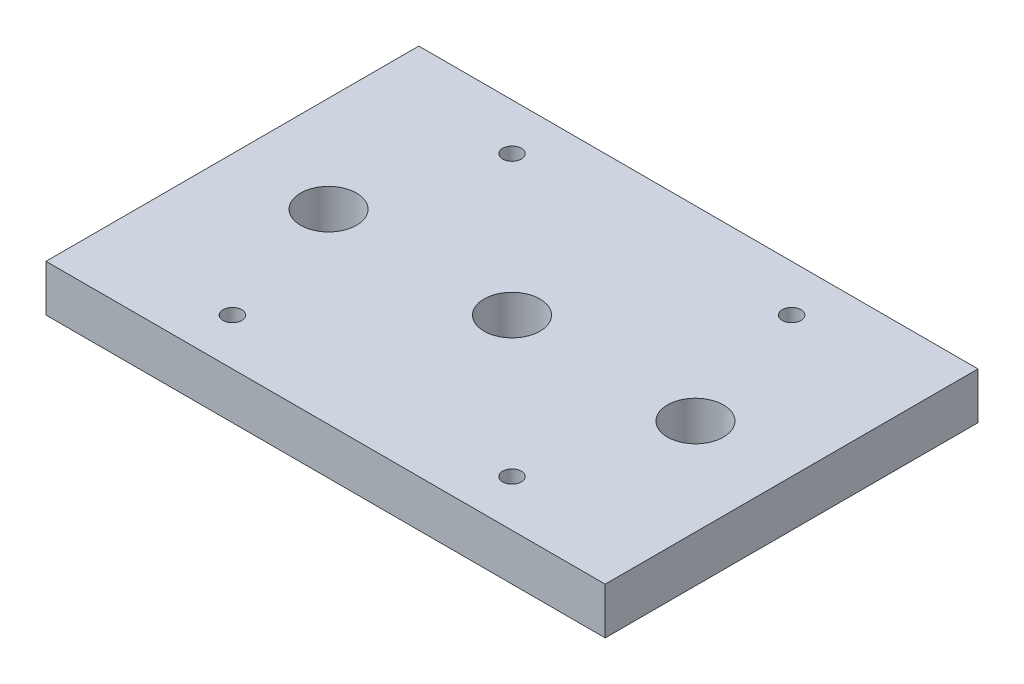
ISO-10303-21;
HEADER;
FILE_DESCRIPTION(('STEP AP214'),'2;1');
FILE_NAME('part.step','',(''),(''),'','','');
FILE_SCHEMA(('AUTOMOTIVE_DESIGN { 1 0 10303 214 1 1 1 1 }'));
ENDSEC;
DATA;
#1=APPLICATION_CONTEXT('core data for automotive mechanical design processes');
#2=APPLICATION_PROTOCOL_DEFINITION('international standard','automotive_design',2000,#1);
#3=PRODUCT_CONTEXT('',#1,'mechanical');
#4=PRODUCT('Part','Part','',(#3));
#5=PRODUCT_RELATED_PRODUCT_CATEGORY('part','',(#4));
#6=PRODUCT_DEFINITION_FORMATION('','',#4);
#7=PRODUCT_DEFINITION_CONTEXT('part definition',#1,'design');
#8=PRODUCT_DEFINITION('design','',#6,#7);
#9=PRODUCT_DEFINITION_SHAPE('','',#8);
#10=(LENGTH_UNIT() NAMED_UNIT(*) SI_UNIT(.MILLI.,.METRE.));
#11=(NAMED_UNIT(*) PLANE_ANGLE_UNIT() SI_UNIT($,.RADIAN.));
#12=(NAMED_UNIT(*) SI_UNIT($,.STERADIAN.) SOLID_ANGLE_UNIT());
#13=UNCERTAINTY_MEASURE_WITH_UNIT(LENGTH_MEASURE(1.E-05),#10,'distance_accuracy_value','');
#14=(GEOMETRIC_REPRESENTATION_CONTEXT(3) GLOBAL_UNCERTAINTY_ASSIGNED_CONTEXT((#13)) GLOBAL_UNIT_ASSIGNED_CONTEXT((#10,
#11,#12)) REPRESENTATION_CONTEXT('',''));
#15=CARTESIAN_POINT('',(0.,0.,0.));
#16=DIRECTION('',(0.,0.,1.));
#17=DIRECTION('',(1.,0.,0.));
#18=AXIS2_PLACEMENT_3D('',#15,#16,#17);
#19=CARTESIAN_POINT('',(0.,12.7,0.));
#20=DIRECTION('',(0.,-1.,0.));
#21=DIRECTION('',(0.,0.,-1.));
#22=AXIS2_PLACEMENT_3D('',#19,#20,#21);
#23=PLANE('',#22);
#24=CARTESIAN_POINT('',(-38.1,12.7,-38.1));
#25=DIRECTION('',(0.,-1.,0.));
#26=DIRECTION('',(0.,0.,-1.));
#27=AXIS2_PLACEMENT_3D('',#24,#25,#26);
#28=CIRCLE('',#27,2.5527);
#29=CARTESIAN_POINT('',(-38.1,12.7,-40.6527));
#30=VERTEX_POINT('',#29);
#31=EDGE_CURVE('E164',#30,#30,#28,.T.);
#32=ORIENTED_EDGE('',*,*,#31,.T.);
#33=EDGE_LOOP('',(#32));
#34=FACE_BOUND('',#33,.T.);
#35=CARTESIAN_POINT('',(38.1,12.7,-38.1));
#36=DIRECTION('',(0.,-1.,0.));
#37=DIRECTION('',(0.,0.,-1.));
#38=AXIS2_PLACEMENT_3D('',#35,#36,#37);
#39=CIRCLE('',#38,2.5527);
#40=CARTESIAN_POINT('',(38.1,12.7,-40.6527));
#41=VERTEX_POINT('',#40);
#42=EDGE_CURVE('E158',#41,#41,#39,.T.);
#43=ORIENTED_EDGE('',*,*,#42,.T.);
#44=EDGE_LOOP('',(#43));
#45=FACE_BOUND('',#44,.T.);
#46=CARTESIAN_POINT('',(38.1000000000008,12.7,38.1));
#47=DIRECTION('',(0.,-1.,0.));
#48=DIRECTION('',(0.,0.,-1.));
#49=AXIS2_PLACEMENT_3D('',#46,#47,#48);
#50=CIRCLE('',#49,2.5527);
#51=CARTESIAN_POINT('',(38.1000000000008,12.7,35.5473));
#52=VERTEX_POINT('',#51);
#53=EDGE_CURVE('E152',#52,#52,#50,.T.);
#54=ORIENTED_EDGE('',*,*,#53,.T.);
#55=EDGE_LOOP('',(#54));
#56=FACE_BOUND('',#55,.T.);
#57=CARTESIAN_POINT('',(-38.0999999999992,12.7,38.1));
#58=DIRECTION('',(0.,-1.,0.));
#59=DIRECTION('',(0.,0.,-1.));
#60=AXIS2_PLACEMENT_3D('',#57,#58,#59);
#61=CIRCLE('',#60,2.5527);
#62=CARTESIAN_POINT('',(-38.0999999999992,12.7,35.5473));
#63=VERTEX_POINT('',#62);
#64=EDGE_CURVE('E146',#63,#63,#61,.T.);
#65=ORIENTED_EDGE('',*,*,#64,.T.);
#66=EDGE_LOOP('',(#65));
#67=FACE_BOUND('',#66,.T.);
#68=CARTESIAN_POINT('',(-50.000000076,12.7,0.));
#69=DIRECTION('',(0.,1.,0.));
#70=DIRECTION('',(0.,0.,1.));
#71=AXIS2_PLACEMENT_3D('',#68,#69,#70);
#72=CIRCLE('',#71,7.62);
#73=CARTESIAN_POINT('',(-50.000000076,12.7,7.62));
#74=VERTEX_POINT('',#73);
#75=EDGE_CURVE('E143',#74,#74,#72,.T.);
#76=ORIENTED_EDGE('',*,*,#75,.F.);
#77=EDGE_LOOP('',(#76));
#78=FACE_BOUND('',#77,.T.);
#79=CARTESIAN_POINT('',(0.,12.7,0.));
#80=DIRECTION('',(0.,1.,0.));
#81=DIRECTION('',(0.,0.,1.));
#82=AXIS2_PLACEMENT_3D('',#79,#80,#81);
#83=CIRCLE('',#82,7.62);
#84=CARTESIAN_POINT('',(0.,12.7,7.62));
#85=VERTEX_POINT('',#84);
#86=EDGE_CURVE('E119',#85,#85,#83,.T.);
#87=ORIENTED_EDGE('',*,*,#86,.F.);
#88=EDGE_LOOP('',(#87));
#89=FACE_BOUND('',#88,.T.);
#90=DIRECTION('',(0.,0.,-1.));
#91=VECTOR('',#90,1.);
#92=CARTESIAN_POINT('',(76.2,12.7,50.8));
#93=LINE('',#92,#91);
#94=CARTESIAN_POINT('',(76.2,12.7,50.8));
#95=VERTEX_POINT('',#94);
#96=CARTESIAN_POINT('',(76.2,12.7,-50.8));
#97=VERTEX_POINT('',#96);
#98=EDGE_CURVE('E85',#95,#97,#93,.T.);
#99=ORIENTED_EDGE('',*,*,#98,.T.);
#100=DIRECTION('',(-1.,0.,0.));
#101=VECTOR('',#100,1.);
#102=CARTESIAN_POINT('',(-76.2,12.7,-50.8));
#103=LINE('',#102,#101);
#104=CARTESIAN_POINT('',(-76.2,12.7,-50.8));
#105=VERTEX_POINT('',#104);
#106=EDGE_CURVE('E80',#97,#105,#103,.T.);
#107=ORIENTED_EDGE('',*,*,#106,.T.);
#108=DIRECTION('',(0.,0.,1.));
#109=VECTOR('',#108,1.);
#110=CARTESIAN_POINT('',(-76.2,12.7,50.8));
#111=LINE('',#110,#109);
#112=CARTESIAN_POINT('',(-76.2,12.7,50.8));
#113=VERTEX_POINT('',#112);
#114=EDGE_CURVE('E83',#105,#113,#111,.T.);
#115=ORIENTED_EDGE('',*,*,#114,.T.);
#116=DIRECTION('',(1.,0.,0.));
#117=VECTOR('',#116,1.);
#118=CARTESIAN_POINT('',(-76.2,12.7,50.8));
#119=LINE('',#118,#117);
#120=EDGE_CURVE('E50',#113,#95,#119,.T.);
#121=ORIENTED_EDGE('',*,*,#120,.T.);
#122=EDGE_LOOP('',(#99,#107,#115,#121));
#123=FACE_BOUND('',#122,.T.);
#124=CARTESIAN_POINT('',(50.000000076,12.7,0.));
#125=DIRECTION('',(0.,1.,0.));
#126=DIRECTION('',(0.,0.,1.));
#127=AXIS2_PLACEMENT_3D('',#124,#125,#126);
#128=CIRCLE('',#127,7.62);
#129=CARTESIAN_POINT('',(50.000000076,12.7,7.62));
#130=VERTEX_POINT('',#129);
#131=EDGE_CURVE('E131',#130,#130,#128,.T.);
#132=ORIENTED_EDGE('',*,*,#131,.F.);
#133=EDGE_LOOP('',(#132));
#134=FACE_BOUND('',#133,.T.);
#135=ADVANCED_FACE('F33',(#34,#45,#56,#67,#78,#89,#123,#134),#23,.F.);
#136=CARTESIAN_POINT('',(76.2,12.7,50.8));
#137=DIRECTION('',(-1.,0.,0.));
#138=DIRECTION('',(0.,0.,1.));
#139=AXIS2_PLACEMENT_3D('',#136,#137,#138);
#140=PLANE('',#139);
#141=DIRECTION('',(0.,0.,-1.));
#142=VECTOR('',#141,1.);
#143=CARTESIAN_POINT('',(76.2,0.,50.8));
#144=LINE('',#143,#142);
#145=CARTESIAN_POINT('',(76.2,0.,50.8));
#146=VERTEX_POINT('',#145);
#147=CARTESIAN_POINT('',(76.2,0.,-50.8));
#148=VERTEX_POINT('',#147);
#149=EDGE_CURVE('E97',#146,#148,#144,.T.);
#150=ORIENTED_EDGE('',*,*,#149,.T.);
#151=DIRECTION('',(0.,-1.,0.));
#152=VECTOR('',#151,1.);
#153=CARTESIAN_POINT('',(76.2,12.7,-50.8));
#154=LINE('',#153,#152);
#155=EDGE_CURVE('E11',#97,#148,#154,.T.);
#156=ORIENTED_EDGE('',*,*,#155,.F.);
#157=ORIENTED_EDGE('',*,*,#98,.F.);
#158=DIRECTION('',(0.,-1.,0.));
#159=VECTOR('',#158,1.);
#160=CARTESIAN_POINT('',(76.2,12.7,50.8));
#161=LINE('',#160,#159);
#162=EDGE_CURVE('E93',#95,#146,#161,.T.);
#163=ORIENTED_EDGE('',*,*,#162,.T.);
#164=EDGE_LOOP('',(#150,#156,#157,#163));
#165=FACE_BOUND('',#164,.T.);
#166=ADVANCED_FACE('F35',(#165),#140,.F.);
#167=CARTESIAN_POINT('',(-76.2,12.7,-50.8));
#168=DIRECTION('',(0.,0.,1.));
#169=DIRECTION('',(1.,0.,0.));
#170=AXIS2_PLACEMENT_3D('',#167,#168,#169);
#171=PLANE('',#170);
#172=DIRECTION('',(-1.,0.,0.));
#173=VECTOR('',#172,1.);
#174=CARTESIAN_POINT('',(-76.2,0.,-50.8));
#175=LINE('',#174,#173);
#176=CARTESIAN_POINT('',(-76.2,0.,-50.8));
#177=VERTEX_POINT('',#176);
#178=EDGE_CURVE('E89',#148,#177,#175,.T.);
#179=ORIENTED_EDGE('',*,*,#178,.T.);
#180=DIRECTION('',(0.,-1.,0.));
#181=VECTOR('',#180,1.);
#182=CARTESIAN_POINT('',(-76.2,12.7,-50.8));
#183=LINE('',#182,#181);
#184=EDGE_CURVE('E42',#105,#177,#183,.T.);
#185=ORIENTED_EDGE('',*,*,#184,.F.);
#186=ORIENTED_EDGE('',*,*,#106,.F.);
#187=ORIENTED_EDGE('',*,*,#155,.T.);
#188=EDGE_LOOP('',(#179,#185,#186,#187));
#189=FACE_BOUND('',#188,.T.);
#190=ADVANCED_FACE('F88',(#189),#171,.F.);
#191=CARTESIAN_POINT('',(-76.2,12.7,50.8));
#192=DIRECTION('',(1.,0.,0.));
#193=DIRECTION('',(0.,0.,-1.));
#194=AXIS2_PLACEMENT_3D('',#191,#192,#193);
#195=PLANE('',#194);
#196=DIRECTION('',(0.,0.,1.));
#197=VECTOR('',#196,1.);
#198=CARTESIAN_POINT('',(-76.2,0.,50.8));
#199=LINE('',#198,#197);
#200=CARTESIAN_POINT('',(-76.2,0.,50.8));
#201=VERTEX_POINT('',#200);
#202=EDGE_CURVE('E67',#177,#201,#199,.T.);
#203=ORIENTED_EDGE('',*,*,#202,.T.);
#204=DIRECTION('',(0.,-1.,0.));
#205=VECTOR('',#204,1.);
#206=CARTESIAN_POINT('',(-76.2,12.7,50.8));
#207=LINE('',#206,#205);
#208=EDGE_CURVE('E90',#113,#201,#207,.T.);
#209=ORIENTED_EDGE('',*,*,#208,.F.);
#210=ORIENTED_EDGE('',*,*,#114,.F.);
#211=ORIENTED_EDGE('',*,*,#184,.T.);
#212=EDGE_LOOP('',(#203,#209,#210,#211));
#213=FACE_BOUND('',#212,.T.);
#214=ADVANCED_FACE('F91',(#213),#195,.F.);
#215=CARTESIAN_POINT('',(-76.2,12.7,50.8));
#216=DIRECTION('',(0.,0.,-1.));
#217=DIRECTION('',(-1.,0.,0.));
#218=AXIS2_PLACEMENT_3D('',#215,#216,#217);
#219=PLANE('',#218);
#220=DIRECTION('',(1.,0.,0.));
#221=VECTOR('',#220,1.);
#222=CARTESIAN_POINT('',(-76.2,0.,50.8));
#223=LINE('',#222,#221);
#224=EDGE_CURVE('E73',#201,#146,#223,.T.);
#225=ORIENTED_EDGE('',*,*,#224,.T.);
#226=ORIENTED_EDGE('',*,*,#162,.F.);
#227=ORIENTED_EDGE('',*,*,#120,.F.);
#228=ORIENTED_EDGE('',*,*,#208,.T.);
#229=EDGE_LOOP('',(#225,#226,#227,#228));
#230=FACE_BOUND('',#229,.T.);
#231=ADVANCED_FACE('F105',(#230),#219,.F.);
#232=CARTESIAN_POINT('',(0.,0.,0.));
#233=DIRECTION('',(0.,-1.,0.));
#234=DIRECTION('',(0.,0.,-1.));
#235=AXIS2_PLACEMENT_3D('',#232,#233,#234);
#236=PLANE('',#235);
#237=CARTESIAN_POINT('',(-38.1,0.,-38.1));
#238=DIRECTION('',(0.,-1.,0.));
#239=DIRECTION('',(0.,0.,-1.));
#240=AXIS2_PLACEMENT_3D('',#237,#238,#239);
#241=CIRCLE('',#240,2.5527);
#242=CARTESIAN_POINT('',(-38.1,0.,-40.6527));
#243=VERTEX_POINT('',#242);
#244=EDGE_CURVE('E167',#243,#243,#241,.T.);
#245=ORIENTED_EDGE('',*,*,#244,.F.);
#246=EDGE_LOOP('',(#245));
#247=FACE_BOUND('',#246,.T.);
#248=CARTESIAN_POINT('',(38.1,0.,-38.1));
#249=DIRECTION('',(0.,-1.,0.));
#250=DIRECTION('',(0.,0.,-1.));
#251=AXIS2_PLACEMENT_3D('',#248,#249,#250);
#252=CIRCLE('',#251,2.5527);
#253=CARTESIAN_POINT('',(38.1,0.,-40.6527));
#254=VERTEX_POINT('',#253);
#255=EDGE_CURVE('E161',#254,#254,#252,.T.);
#256=ORIENTED_EDGE('',*,*,#255,.F.);
#257=EDGE_LOOP('',(#256));
#258=FACE_BOUND('',#257,.T.);
#259=CARTESIAN_POINT('',(38.1000000000008,0.,38.1));
#260=DIRECTION('',(0.,-1.,0.));
#261=DIRECTION('',(0.,0.,-1.));
#262=AXIS2_PLACEMENT_3D('',#259,#260,#261);
#263=CIRCLE('',#262,2.5527);
#264=CARTESIAN_POINT('',(38.1000000000008,0.,35.5473));
#265=VERTEX_POINT('',#264);
#266=EDGE_CURVE('E155',#265,#265,#263,.T.);
#267=ORIENTED_EDGE('',*,*,#266,.F.);
#268=EDGE_LOOP('',(#267));
#269=FACE_BOUND('',#268,.T.);
#270=CARTESIAN_POINT('',(-38.0999999999992,0.,38.1));
#271=DIRECTION('',(0.,-1.,0.));
#272=DIRECTION('',(0.,0.,-1.));
#273=AXIS2_PLACEMENT_3D('',#270,#271,#272);
#274=CIRCLE('',#273,2.5527);
#275=CARTESIAN_POINT('',(-38.0999999999992,0.,35.5473));
#276=VERTEX_POINT('',#275);
#277=EDGE_CURVE('E149',#276,#276,#274,.T.);
#278=ORIENTED_EDGE('',*,*,#277,.F.);
#279=EDGE_LOOP('',(#278));
#280=FACE_BOUND('',#279,.T.);
#281=CARTESIAN_POINT('',(-50.000000076,0.,0.));
#282=DIRECTION('',(0.,1.,0.));
#283=DIRECTION('',(0.,0.,1.));
#284=AXIS2_PLACEMENT_3D('',#281,#282,#283);
#285=CIRCLE('',#284,5.04189999999999);
#286=CARTESIAN_POINT('',(-50.000000076,0.,5.04189999999999));
#287=VERTEX_POINT('',#286);
#288=EDGE_CURVE('E134',#287,#287,#285,.T.);
#289=ORIENTED_EDGE('',*,*,#288,.T.);
#290=EDGE_LOOP('',(#289));
#291=FACE_BOUND('',#290,.T.);
#292=CARTESIAN_POINT('',(50.000000076,0.,0.));
#293=DIRECTION('',(0.,1.,0.));
#294=DIRECTION('',(0.,0.,1.));
#295=AXIS2_PLACEMENT_3D('',#292,#293,#294);
#296=CIRCLE('',#295,5.04189999999999);
#297=CARTESIAN_POINT('',(50.000000076,0.,5.04189999999999));
#298=VERTEX_POINT('',#297);
#299=EDGE_CURVE('E122',#298,#298,#296,.T.);
#300=ORIENTED_EDGE('',*,*,#299,.T.);
#301=EDGE_LOOP('',(#300));
#302=FACE_BOUND('',#301,.T.);
#303=CARTESIAN_POINT('',(0.,0.,0.));
#304=DIRECTION('',(0.,1.,0.));
#305=DIRECTION('',(0.,0.,1.));
#306=AXIS2_PLACEMENT_3D('',#303,#304,#305);
#307=CIRCLE('',#306,5.0419);
#308=CARTESIAN_POINT('',(0.,0.,5.0419));
#309=VERTEX_POINT('',#308);
#310=EDGE_CURVE('E100',#309,#309,#307,.T.);
#311=ORIENTED_EDGE('',*,*,#310,.T.);
#312=EDGE_LOOP('',(#311));
#313=FACE_BOUND('',#312,.T.);
#314=ORIENTED_EDGE('',*,*,#149,.F.);
#315=ORIENTED_EDGE('',*,*,#224,.F.);
#316=ORIENTED_EDGE('',*,*,#202,.F.);
#317=ORIENTED_EDGE('',*,*,#178,.F.);
#318=EDGE_LOOP('',(#314,#315,#316,#317));
#319=FACE_BOUND('',#318,.T.);
#320=ADVANCED_FACE('F108',(#247,#258,#269,#280,#291,#302,#313,#319),#236,.T.);
#321=CARTESIAN_POINT('',(0.,12.7,0.));
#322=DIRECTION('',(0.,1.,0.));
#323=DIRECTION('',(0.,0.,1.));
#324=AXIS2_PLACEMENT_3D('',#321,#322,#323);
#325=CYLINDRICAL_SURFACE('',#324,5.0419);
#326=ORIENTED_EDGE('',*,*,#310,.F.);
#327=EDGE_LOOP('',(#326));
#328=FACE_BOUND('',#327,.T.);
#329=CARTESIAN_POINT('',(0.,1.524,0.));
#330=DIRECTION('',(0.,1.,0.));
#331=DIRECTION('',(0.,0.,1.));
#332=AXIS2_PLACEMENT_3D('',#329,#330,#331);
#333=CIRCLE('',#332,5.0419);
#334=CARTESIAN_POINT('',(0.,1.524,5.0419));
#335=VERTEX_POINT('',#334);
#336=EDGE_CURVE('E113',#335,#335,#333,.T.);
#337=ORIENTED_EDGE('',*,*,#336,.T.);
#338=EDGE_LOOP('',(#337));
#339=FACE_BOUND('',#338,.T.);
#340=ADVANCED_FACE('F175',(#328,#339),#325,.F.);
#341=CARTESIAN_POINT('',(5.0419,1.524,0.));
#342=DIRECTION('',(0.,-1.,0.));
#343=DIRECTION('',(0.,0.,-1.));
#344=AXIS2_PLACEMENT_3D('',#341,#342,#343);
#345=PLANE('',#344);
#346=ORIENTED_EDGE('',*,*,#336,.F.);
#347=EDGE_LOOP('',(#346));
#348=FACE_BOUND('',#347,.T.);
#349=CARTESIAN_POINT('',(0.,1.524,0.));
#350=DIRECTION('',(0.,1.,0.));
#351=DIRECTION('',(0.,0.,1.));
#352=AXIS2_PLACEMENT_3D('',#349,#350,#351);
#353=CIRCLE('',#352,7.62);
#354=CARTESIAN_POINT('',(0.,1.524,7.62));
#355=VERTEX_POINT('',#354);
#356=EDGE_CURVE('E116',#355,#355,#353,.T.);
#357=ORIENTED_EDGE('',*,*,#356,.T.);
#358=EDGE_LOOP('',(#357));
#359=FACE_BOUND('',#358,.T.);
#360=ADVANCED_FACE('F191',(#348,#359),#345,.F.);
#361=CARTESIAN_POINT('',(0.,12.7,0.));
#362=DIRECTION('',(0.,1.,0.));
#363=DIRECTION('',(0.,0.,1.));
#364=AXIS2_PLACEMENT_3D('',#361,#362,#363);
#365=CYLINDRICAL_SURFACE('',#364,7.62);
#366=ORIENTED_EDGE('',*,*,#356,.F.);
#367=EDGE_LOOP('',(#366));
#368=FACE_BOUND('',#367,.T.);
#369=ORIENTED_EDGE('',*,*,#86,.T.);
#370=EDGE_LOOP('',(#369));
#371=FACE_BOUND('',#370,.T.);
#372=ADVANCED_FACE('F197',(#368,#371),#365,.F.);
#373=CARTESIAN_POINT('',(50.000000076,12.7,0.));
#374=DIRECTION('',(0.,1.,0.));
#375=DIRECTION('',(0.,0.,1.));
#376=AXIS2_PLACEMENT_3D('',#373,#374,#375);
#377=CYLINDRICAL_SURFACE('',#376,5.0419);
#378=ORIENTED_EDGE('',*,*,#299,.F.);
#379=EDGE_LOOP('',(#378));
#380=FACE_BOUND('',#379,.T.);
#381=CARTESIAN_POINT('',(50.000000076,1.524,0.));
#382=DIRECTION('',(0.,1.,0.));
#383=DIRECTION('',(0.,0.,1.));
#384=AXIS2_PLACEMENT_3D('',#381,#382,#383);
#385=CIRCLE('',#384,5.0419);
#386=CARTESIAN_POINT('',(50.000000076,1.524,5.0419));
#387=VERTEX_POINT('',#386);
#388=EDGE_CURVE('E125',#387,#387,#385,.T.);
#389=ORIENTED_EDGE('',*,*,#388,.T.);
#390=EDGE_LOOP('',(#389));
#391=FACE_BOUND('',#390,.T.);
#392=ADVANCED_FACE('F203',(#380,#391),#377,.F.);
#393=CARTESIAN_POINT('',(55.041900076,1.524,0.));
#394=DIRECTION('',(0.,-1.,0.));
#395=DIRECTION('',(0.,0.,-1.));
#396=AXIS2_PLACEMENT_3D('',#393,#394,#395);
#397=PLANE('',#396);
#398=ORIENTED_EDGE('',*,*,#388,.F.);
#399=EDGE_LOOP('',(#398));
#400=FACE_BOUND('',#399,.T.);
#401=CARTESIAN_POINT('',(50.000000076,1.524,0.));
#402=DIRECTION('',(0.,1.,0.));
#403=DIRECTION('',(0.,0.,1.));
#404=AXIS2_PLACEMENT_3D('',#401,#402,#403);
#405=CIRCLE('',#404,7.61999999999999);
#406=CARTESIAN_POINT('',(50.000000076,1.524,7.61999999999999));
#407=VERTEX_POINT('',#406);
#408=EDGE_CURVE('E128',#407,#407,#405,.T.);
#409=ORIENTED_EDGE('',*,*,#408,.T.);
#410=EDGE_LOOP('',(#409));
#411=FACE_BOUND('',#410,.T.);
#412=ADVANCED_FACE('F254',(#400,#411),#397,.F.);
#413=CARTESIAN_POINT('',(50.000000076,12.7,0.));
#414=DIRECTION('',(0.,1.,0.));
#415=DIRECTION('',(0.,0.,1.));
#416=AXIS2_PLACEMENT_3D('',#413,#414,#415);
#417=CYLINDRICAL_SURFACE('',#416,7.62);
#418=ORIENTED_EDGE('',*,*,#408,.F.);
#419=EDGE_LOOP('',(#418));
#420=FACE_BOUND('',#419,.T.);
#421=ORIENTED_EDGE('',*,*,#131,.T.);
#422=EDGE_LOOP('',(#421));
#423=FACE_BOUND('',#422,.T.);
#424=ADVANCED_FACE('F262',(#420,#423),#417,.F.);
#425=CARTESIAN_POINT('',(-50.000000076,12.7,0.));
#426=DIRECTION('',(0.,1.,0.));
#427=DIRECTION('',(0.,0.,1.));
#428=AXIS2_PLACEMENT_3D('',#425,#426,#427);
#429=CYLINDRICAL_SURFACE('',#428,5.0419);
#430=ORIENTED_EDGE('',*,*,#288,.F.);
#431=EDGE_LOOP('',(#430));
#432=FACE_BOUND('',#431,.T.);
#433=CARTESIAN_POINT('',(-50.000000076,1.524,0.));
#434=DIRECTION('',(0.,1.,0.));
#435=DIRECTION('',(0.,0.,1.));
#436=AXIS2_PLACEMENT_3D('',#433,#434,#435);
#437=CIRCLE('',#436,5.0419);
#438=CARTESIAN_POINT('',(-50.000000076,1.524,5.0419));
#439=VERTEX_POINT('',#438);
#440=EDGE_CURVE('E137',#439,#439,#437,.T.);
#441=ORIENTED_EDGE('',*,*,#440,.T.);
#442=EDGE_LOOP('',(#441));
#443=FACE_BOUND('',#442,.T.);
#444=ADVANCED_FACE('F270',(#432,#443),#429,.F.);
#445=CARTESIAN_POINT('',(-44.958100076,1.524,0.));
#446=DIRECTION('',(0.,-1.,0.));
#447=DIRECTION('',(0.,0.,-1.));
#448=AXIS2_PLACEMENT_3D('',#445,#446,#447);
#449=PLANE('',#448);
#450=ORIENTED_EDGE('',*,*,#440,.F.);
#451=EDGE_LOOP('',(#450));
#452=FACE_BOUND('',#451,.T.);
#453=CARTESIAN_POINT('',(-50.000000076,1.524,0.));
#454=DIRECTION('',(0.,1.,0.));
#455=DIRECTION('',(0.,0.,1.));
#456=AXIS2_PLACEMENT_3D('',#453,#454,#455);
#457=CIRCLE('',#456,7.61999999999999);
#458=CARTESIAN_POINT('',(-50.000000076,1.524,7.61999999999999));
#459=VERTEX_POINT('',#458);
#460=EDGE_CURVE('E140',#459,#459,#457,.T.);
#461=ORIENTED_EDGE('',*,*,#460,.T.);
#462=EDGE_LOOP('',(#461));
#463=FACE_BOUND('',#462,.T.);
#464=ADVANCED_FACE('F278',(#452,#463),#449,.F.);
#465=CARTESIAN_POINT('',(-50.000000076,12.7,0.));
#466=DIRECTION('',(0.,1.,0.));
#467=DIRECTION('',(0.,0.,1.));
#468=AXIS2_PLACEMENT_3D('',#465,#466,#467);
#469=CYLINDRICAL_SURFACE('',#468,7.62);
#470=ORIENTED_EDGE('',*,*,#460,.F.);
#471=EDGE_LOOP('',(#470));
#472=FACE_BOUND('',#471,.T.);
#473=ORIENTED_EDGE('',*,*,#75,.T.);
#474=EDGE_LOOP('',(#473));
#475=FACE_BOUND('',#474,.T.);
#476=ADVANCED_FACE('F286',(#472,#475),#469,.F.);
#477=CARTESIAN_POINT('',(-38.0999999999992,0.,38.1));
#478=DIRECTION('',(0.,-1.,0.));
#479=DIRECTION('',(0.,0.,-1.));
#480=AXIS2_PLACEMENT_3D('',#477,#478,#479);
#481=CYLINDRICAL_SURFACE('',#480,2.5527);
#482=ORIENTED_EDGE('',*,*,#64,.F.);
#483=EDGE_LOOP('',(#482));
#484=FACE_BOUND('',#483,.T.);
#485=ORIENTED_EDGE('',*,*,#277,.T.);
#486=EDGE_LOOP('',(#485));
#487=FACE_BOUND('',#486,.T.);
#488=ADVANCED_FACE('F294',(#484,#487),#481,.F.);
#489=CARTESIAN_POINT('',(38.1000000000008,0.,38.1));
#490=DIRECTION('',(0.,-1.,0.));
#491=DIRECTION('',(0.,0.,-1.));
#492=AXIS2_PLACEMENT_3D('',#489,#490,#491);
#493=CYLINDRICAL_SURFACE('',#492,2.5527);
#494=ORIENTED_EDGE('',*,*,#53,.F.);
#495=EDGE_LOOP('',(#494));
#496=FACE_BOUND('',#495,.T.);
#497=ORIENTED_EDGE('',*,*,#266,.T.);
#498=EDGE_LOOP('',(#497));
#499=FACE_BOUND('',#498,.T.);
#500=ADVANCED_FACE('F301',(#496,#499),#493,.F.);
#501=CARTESIAN_POINT('',(38.1,0.,-38.1));
#502=DIRECTION('',(0.,-1.,0.));
#503=DIRECTION('',(0.,0.,-1.));
#504=AXIS2_PLACEMENT_3D('',#501,#502,#503);
#505=CYLINDRICAL_SURFACE('',#504,2.5527);
#506=ORIENTED_EDGE('',*,*,#42,.F.);
#507=EDGE_LOOP('',(#506));
#508=FACE_BOUND('',#507,.T.);
#509=ORIENTED_EDGE('',*,*,#255,.T.);
#510=EDGE_LOOP('',(#509));
#511=FACE_BOUND('',#510,.T.);
#512=ADVANCED_FACE('F309',(#508,#511),#505,.F.);
#513=CARTESIAN_POINT('',(-38.1,0.,-38.1));
#514=DIRECTION('',(0.,-1.,0.));
#515=DIRECTION('',(0.,0.,-1.));
#516=AXIS2_PLACEMENT_3D('',#513,#514,#515);
#517=CYLINDRICAL_SURFACE('',#516,2.5527);
#518=ORIENTED_EDGE('',*,*,#31,.F.);
#519=EDGE_LOOP('',(#518));
#520=FACE_BOUND('',#519,.T.);
#521=ORIENTED_EDGE('',*,*,#244,.T.);
#522=EDGE_LOOP('',(#521));
#523=FACE_BOUND('',#522,.T.);
#524=ADVANCED_FACE('F171',(#520,#523),#517,.F.);
#525=CLOSED_SHELL('',(#135,#166,#190,#214,#231,#320,#340,#360,#372,#392,#412,#424,#444,#464,
#476,#488,#500,#512,#524));
#526=MANIFOLD_SOLID_BREP('B2',#525);
#527=ADVANCED_BREP_SHAPE_REPRESENTATION('',(#18,#526),#14);
#528=SHAPE_DEFINITION_REPRESENTATION(#9,#527);
ENDSEC;
END-ISO-10303-21;
